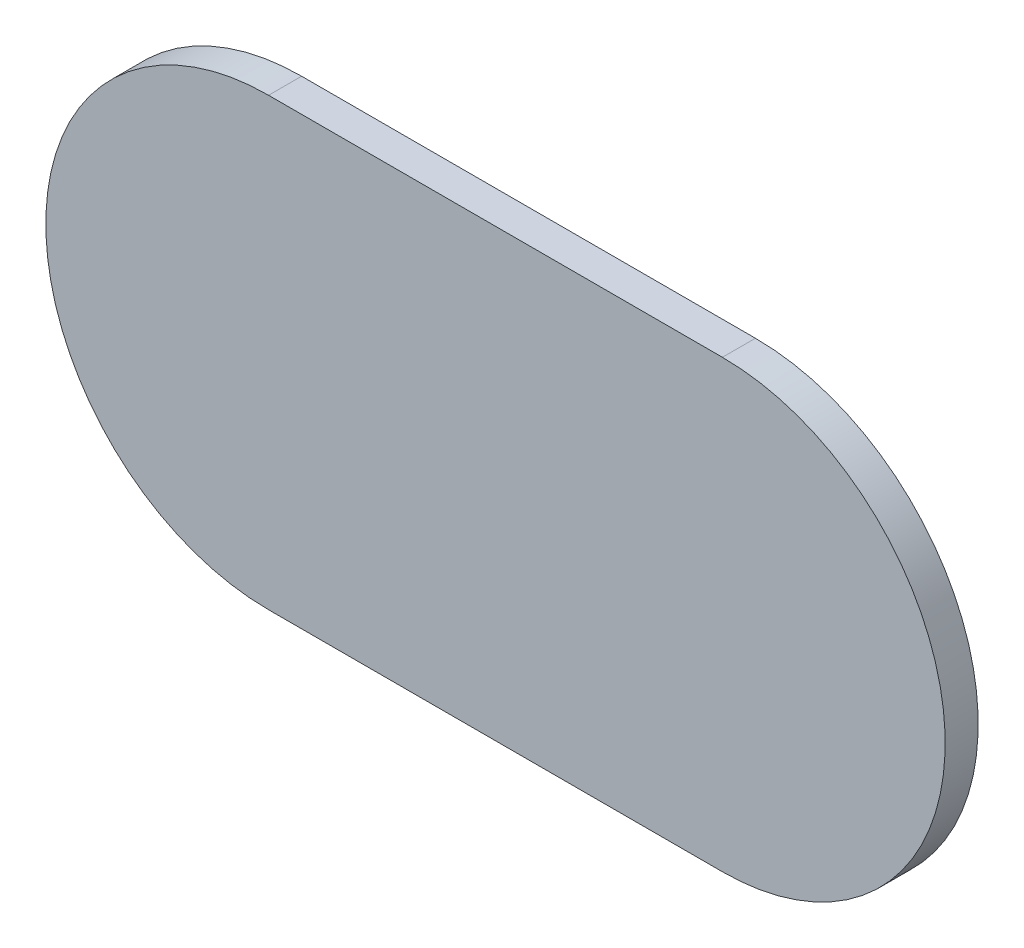
ISO-10303-21;
HEADER;
FILE_DESCRIPTION(('STEP AP214'),'2;1');
FILE_NAME('part.step','',(''),(''),'','','');
FILE_SCHEMA(('AUTOMOTIVE_DESIGN { 1 0 10303 214 1 1 1 1 }'));
ENDSEC;
DATA;
#1=APPLICATION_CONTEXT('core data for automotive mechanical design processes');
#2=APPLICATION_PROTOCOL_DEFINITION('international standard','automotive_design',2000,#1);
#3=PRODUCT_CONTEXT('',#1,'mechanical');
#4=PRODUCT('Part','Part','',(#3));
#5=PRODUCT_RELATED_PRODUCT_CATEGORY('part','',(#4));
#6=PRODUCT_DEFINITION_FORMATION('','',#4);
#7=PRODUCT_DEFINITION_CONTEXT('part definition',#1,'design');
#8=PRODUCT_DEFINITION('design','',#6,#7);
#9=PRODUCT_DEFINITION_SHAPE('','',#8);
#10=(LENGTH_UNIT() NAMED_UNIT(*) SI_UNIT(.MILLI.,.METRE.));
#11=(NAMED_UNIT(*) PLANE_ANGLE_UNIT() SI_UNIT($,.RADIAN.));
#12=(NAMED_UNIT(*) SI_UNIT($,.STERADIAN.) SOLID_ANGLE_UNIT());
#13=UNCERTAINTY_MEASURE_WITH_UNIT(LENGTH_MEASURE(1.E-05),#10,'distance_accuracy_value','');
#14=(GEOMETRIC_REPRESENTATION_CONTEXT(3) GLOBAL_UNCERTAINTY_ASSIGNED_CONTEXT((#13)) GLOBAL_UNIT_ASSIGNED_CONTEXT((#10,
#11,#12)) REPRESENTATION_CONTEXT('',''));
#15=CARTESIAN_POINT('',(0.,0.,0.));
#16=DIRECTION('',(0.,0.,1.));
#17=DIRECTION('',(1.,0.,0.));
#18=AXIS2_PLACEMENT_3D('',#15,#16,#17);
#19=CARTESIAN_POINT('',(2.75,0.,0.4));
#20=DIRECTION('',(0.,0.,-1.));
#21=DIRECTION('',(-1.,0.,0.));
#22=AXIS2_PLACEMENT_3D('',#19,#20,#21);
#23=CYLINDRICAL_SURFACE('',#22,2.7);
#24=CARTESIAN_POINT('',(2.75,0.,0.));
#25=DIRECTION('',(0.,0.,1.));
#26=DIRECTION('',(1.,0.,0.));
#27=AXIS2_PLACEMENT_3D('',#24,#25,#26);
#28=CIRCLE('',#27,2.7);
#29=CARTESIAN_POINT('',(2.75,-2.7,0.));
#30=VERTEX_POINT('',#29);
#31=CARTESIAN_POINT('',(2.75,2.7,0.));
#32=VERTEX_POINT('',#31);
#33=EDGE_CURVE('E105',#30,#32,#28,.T.);
#34=ORIENTED_EDGE('',*,*,#33,.T.);
#35=DIRECTION('',(0.,0.,-1.));
#36=VECTOR('',#35,1.);
#37=CARTESIAN_POINT('',(2.75,2.7,0.4));
#38=LINE('',#37,#36);
#39=CARTESIAN_POINT('',(2.75,2.7,0.4));
#40=VERTEX_POINT('',#39);
#41=EDGE_CURVE('E11',#40,#32,#38,.T.);
#42=ORIENTED_EDGE('',*,*,#41,.F.);
#43=CARTESIAN_POINT('',(2.75,0.,0.4));
#44=DIRECTION('',(0.,0.,1.));
#45=DIRECTION('',(1.,0.,0.));
#46=AXIS2_PLACEMENT_3D('',#43,#44,#45);
#47=CIRCLE('',#46,2.7);
#48=CARTESIAN_POINT('',(2.75,-2.7,0.4));
#49=VERTEX_POINT('',#48);
#50=EDGE_CURVE('E89',#49,#40,#47,.T.);
#51=ORIENTED_EDGE('',*,*,#50,.F.);
#52=DIRECTION('',(0.,0.,-1.));
#53=VECTOR('',#52,1.);
#54=CARTESIAN_POINT('',(2.75,-2.7,0.4));
#55=LINE('',#54,#53);
#56=EDGE_CURVE('E98',#49,#30,#55,.T.);
#57=ORIENTED_EDGE('',*,*,#56,.T.);
#58=EDGE_LOOP('',(#34,#42,#51,#57));
#59=FACE_BOUND('',#58,.T.);
#60=ADVANCED_FACE('F39',(#59),#23,.T.);
#61=CARTESIAN_POINT('',(2.75,2.7,0.4));
#62=DIRECTION('',(0.,-1.,0.));
#63=DIRECTION('',(1.,0.,0.));
#64=AXIS2_PLACEMENT_3D('',#61,#62,#63);
#65=PLANE('',#64);
#66=DIRECTION('',(-1.,0.,0.));
#67=VECTOR('',#66,1.);
#68=CARTESIAN_POINT('',(2.75,2.7,0.));
#69=LINE('',#68,#67);
#70=CARTESIAN_POINT('',(-2.75,2.7,0.));
#71=VERTEX_POINT('',#70);
#72=EDGE_CURVE('E94',#32,#71,#69,.T.);
#73=ORIENTED_EDGE('',*,*,#72,.T.);
#74=DIRECTION('',(0.,0.,-1.));
#75=VECTOR('',#74,1.);
#76=CARTESIAN_POINT('',(-2.75,2.7,0.4));
#77=LINE('',#76,#75);
#78=CARTESIAN_POINT('',(-2.75,2.7,0.4));
#79=VERTEX_POINT('',#78);
#80=EDGE_CURVE('E50',#79,#71,#77,.T.);
#81=ORIENTED_EDGE('',*,*,#80,.F.);
#82=DIRECTION('',(-1.,0.,0.));
#83=VECTOR('',#82,1.);
#84=CARTESIAN_POINT('',(2.75,2.7,0.4));
#85=LINE('',#84,#83);
#86=EDGE_CURVE('E82',#40,#79,#85,.T.);
#87=ORIENTED_EDGE('',*,*,#86,.F.);
#88=ORIENTED_EDGE('',*,*,#41,.T.);
#89=EDGE_LOOP('',(#73,#81,#87,#88));
#90=FACE_BOUND('',#89,.T.);
#91=ADVANCED_FACE('F91',(#90),#65,.F.);
#92=CARTESIAN_POINT('',(-2.75,0.,0.4));
#93=DIRECTION('',(0.,0.,-1.));
#94=DIRECTION('',(-1.,0.,0.));
#95=AXIS2_PLACEMENT_3D('',#92,#93,#94);
#96=CYLINDRICAL_SURFACE('',#95,2.7);
#97=CARTESIAN_POINT('',(-2.75,0.,0.));
#98=DIRECTION('',(0.,0.,1.));
#99=DIRECTION('',(1.,0.,0.));
#100=AXIS2_PLACEMENT_3D('',#97,#98,#99);
#101=CIRCLE('',#100,2.7);
#102=CARTESIAN_POINT('',(-2.75,-2.7,0.));
#103=VERTEX_POINT('',#102);
#104=EDGE_CURVE('E75',#71,#103,#101,.T.);
#105=ORIENTED_EDGE('',*,*,#104,.T.);
#106=DIRECTION('',(0.,0.,-1.));
#107=VECTOR('',#106,1.);
#108=CARTESIAN_POINT('',(-2.75,-2.7,0.4));
#109=LINE('',#108,#107);
#110=CARTESIAN_POINT('',(-2.75,-2.7,0.4));
#111=VERTEX_POINT('',#110);
#112=EDGE_CURVE('E92',#111,#103,#109,.T.);
#113=ORIENTED_EDGE('',*,*,#112,.F.);
#114=CARTESIAN_POINT('',(-2.75,0.,0.4));
#115=DIRECTION('',(0.,0.,1.));
#116=DIRECTION('',(1.,0.,0.));
#117=AXIS2_PLACEMENT_3D('',#114,#115,#116);
#118=CIRCLE('',#117,2.7);
#119=EDGE_CURVE('E86',#79,#111,#118,.T.);
#120=ORIENTED_EDGE('',*,*,#119,.F.);
#121=ORIENTED_EDGE('',*,*,#80,.T.);
#122=EDGE_LOOP('',(#105,#113,#120,#121));
#123=FACE_BOUND('',#122,.T.);
#124=ADVANCED_FACE('F96',(#123),#96,.T.);
#125=CARTESIAN_POINT('',(2.75,-2.7,0.4));
#126=DIRECTION('',(0.,1.,0.));
#127=DIRECTION('',(-1.,0.,0.));
#128=AXIS2_PLACEMENT_3D('',#125,#126,#127);
#129=PLANE('',#128);
#130=DIRECTION('',(1.,0.,0.));
#131=VECTOR('',#130,1.);
#132=CARTESIAN_POINT('',(2.75,-2.7,0.));
#133=LINE('',#132,#131);
#134=EDGE_CURVE('E79',#103,#30,#133,.T.);
#135=ORIENTED_EDGE('',*,*,#134,.T.);
#136=ORIENTED_EDGE('',*,*,#56,.F.);
#137=DIRECTION('',(1.,0.,0.));
#138=VECTOR('',#137,1.);
#139=CARTESIAN_POINT('',(2.75,-2.7,0.4));
#140=LINE('',#139,#138);
#141=EDGE_CURVE('E54',#111,#49,#140,.T.);
#142=ORIENTED_EDGE('',*,*,#141,.F.);
#143=ORIENTED_EDGE('',*,*,#112,.T.);
#144=EDGE_LOOP('',(#135,#136,#142,#143));
#145=FACE_BOUND('',#144,.T.);
#146=ADVANCED_FACE('F108',(#145),#129,.F.);
#147=CARTESIAN_POINT('',(2.75,0.,0.4));
#148=DIRECTION('',(0.,0.,1.));
#149=DIRECTION('',(1.,0.,0.));
#150=AXIS2_PLACEMENT_3D('',#147,#148,#149);
#151=PLANE('',#150);
#152=ORIENTED_EDGE('',*,*,#50,.T.);
#153=ORIENTED_EDGE('',*,*,#86,.T.);
#154=ORIENTED_EDGE('',*,*,#119,.T.);
#155=ORIENTED_EDGE('',*,*,#141,.T.);
#156=EDGE_LOOP('',(#152,#153,#154,#155));
#157=FACE_BOUND('',#156,.T.);
#158=ADVANCED_FACE('F88',(#157),#151,.T.);
#159=CARTESIAN_POINT('',(2.75,0.,0.));
#160=DIRECTION('',(0.,0.,1.));
#161=DIRECTION('',(1.,0.,0.));
#162=AXIS2_PLACEMENT_3D('',#159,#160,#161);
#163=PLANE('',#162);
#164=ORIENTED_EDGE('',*,*,#33,.F.);
#165=ORIENTED_EDGE('',*,*,#134,.F.);
#166=ORIENTED_EDGE('',*,*,#104,.F.);
#167=ORIENTED_EDGE('',*,*,#72,.F.);
#168=EDGE_LOOP('',(#164,#165,#166,#167));
#169=FACE_BOUND('',#168,.T.);
#170=ADVANCED_FACE('F115',(#169),#163,.F.);
#171=CLOSED_SHELL('',(#60,#91,#124,#146,#158,#170));
#172=MANIFOLD_SOLID_BREP('B2',#171);
#173=ADVANCED_BREP_SHAPE_REPRESENTATION('',(#18,#172),#14);
#174=SHAPE_DEFINITION_REPRESENTATION(#9,#173);
ENDSEC;
END-ISO-10303-21;
